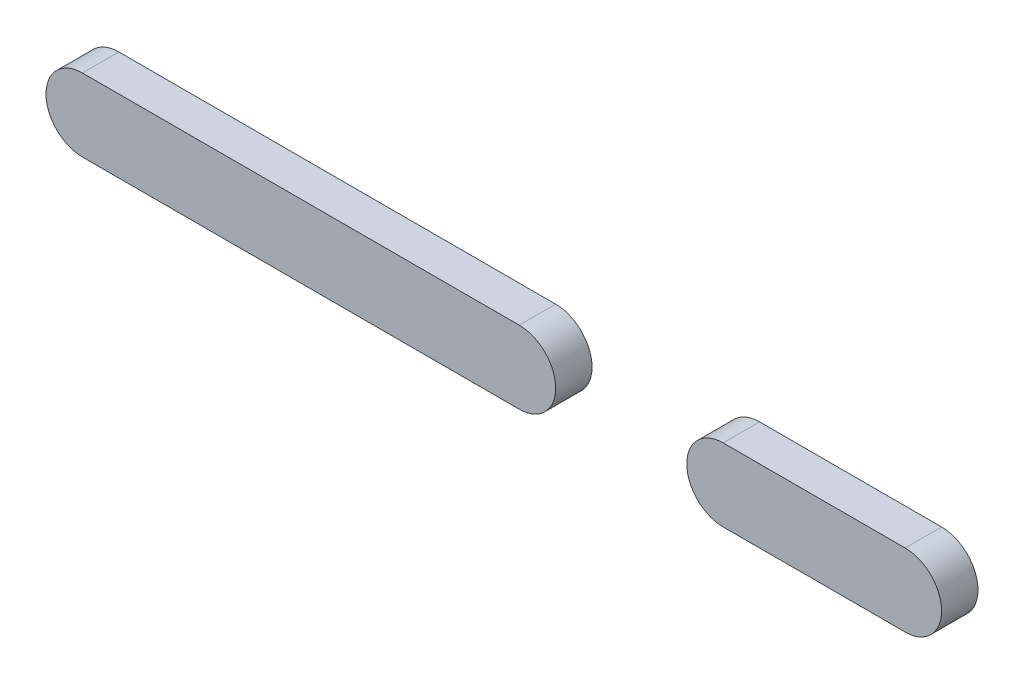
ISO-10303-21;
HEADER;
FILE_DESCRIPTION(('STEP AP214'),'2;1');
FILE_NAME('part.step','',(''),(''),'','','');
FILE_SCHEMA(('AUTOMOTIVE_DESIGN { 1 0 10303 214 1 1 1 1 }'));
ENDSEC;
DATA;
#1=APPLICATION_CONTEXT('core data for automotive mechanical design processes');
#2=APPLICATION_PROTOCOL_DEFINITION('international standard','automotive_design',2000,#1);
#3=PRODUCT_CONTEXT('',#1,'mechanical');
#4=PRODUCT('Part','Part','',(#3));
#5=PRODUCT_RELATED_PRODUCT_CATEGORY('part','',(#4));
#6=PRODUCT_DEFINITION_FORMATION('','',#4);
#7=PRODUCT_DEFINITION_CONTEXT('part definition',#1,'design');
#8=PRODUCT_DEFINITION('design','',#6,#7);
#9=PRODUCT_DEFINITION_SHAPE('','',#8);
#10=(LENGTH_UNIT() NAMED_UNIT(*) SI_UNIT(.MILLI.,.METRE.));
#11=(NAMED_UNIT(*) PLANE_ANGLE_UNIT() SI_UNIT($,.RADIAN.));
#12=(NAMED_UNIT(*) SI_UNIT($,.STERADIAN.) SOLID_ANGLE_UNIT());
#13=UNCERTAINTY_MEASURE_WITH_UNIT(LENGTH_MEASURE(1.E-05),#10,'distance_accuracy_value','');
#14=(GEOMETRIC_REPRESENTATION_CONTEXT(3) GLOBAL_UNCERTAINTY_ASSIGNED_CONTEXT((#13)) GLOBAL_UNIT_ASSIGNED_CONTEXT((#10,
#11,#12)) REPRESENTATION_CONTEXT('',''));
#15=CARTESIAN_POINT('',(0.,0.,0.));
#16=DIRECTION('',(0.,0.,1.));
#17=DIRECTION('',(1.,0.,0.));
#18=AXIS2_PLACEMENT_3D('',#15,#16,#17);
#19=CARTESIAN_POINT('',(1.03299492385786,-1.58676219316339,1.));
#20=DIRECTION('',(0.,0.,-1.));
#21=DIRECTION('',(-1.,0.,0.));
#22=AXIS2_PLACEMENT_3D('',#19,#20,#21);
#23=CYLINDRICAL_SURFACE('',#22,1.);
#24=CARTESIAN_POINT('',(1.03299492385786,-1.58676219316339,0.));
#25=DIRECTION('',(0.,0.,1.));
#26=DIRECTION('',(1.,0.,0.));
#27=AXIS2_PLACEMENT_3D('',#24,#25,#26);
#28=CIRCLE('',#27,1.);
#29=CARTESIAN_POINT('',(1.03299492385786,-0.586762193163393,0.));
#30=VERTEX_POINT('',#29);
#31=CARTESIAN_POINT('',(1.03299492385786,-2.58676219316339,0.));
#32=VERTEX_POINT('',#31);
#33=EDGE_CURVE('E12',#30,#32,#28,.T.);
#34=ORIENTED_EDGE('',*,*,#33,.T.);
#35=DIRECTION('',(0.,0.,-1.));
#36=VECTOR('',#35,1.);
#37=CARTESIAN_POINT('',(1.03299492385786,-2.58676219316339,1.));
#38=LINE('',#37,#36);
#39=CARTESIAN_POINT('',(1.03299492385786,-2.58676219316339,1.));
#40=VERTEX_POINT('',#39);
#41=EDGE_CURVE('E122',#40,#32,#38,.T.);
#42=ORIENTED_EDGE('',*,*,#41,.F.);
#43=CARTESIAN_POINT('',(1.03299492385786,-1.58676219316339,1.));
#44=DIRECTION('',(0.,0.,1.));
#45=DIRECTION('',(1.,0.,0.));
#46=AXIS2_PLACEMENT_3D('',#43,#44,#45);
#47=CIRCLE('',#46,1.);
#48=CARTESIAN_POINT('',(1.03299492385786,-0.586762193163393,1.));
#49=VERTEX_POINT('',#48);
#50=EDGE_CURVE('E55',#49,#40,#47,.T.);
#51=ORIENTED_EDGE('',*,*,#50,.F.);
#52=DIRECTION('',(0.,0.,-1.));
#53=VECTOR('',#52,1.);
#54=CARTESIAN_POINT('',(1.03299492385786,-0.586762193163393,1.));
#55=LINE('',#54,#53);
#56=EDGE_CURVE('E110',#49,#30,#55,.T.);
#57=ORIENTED_EDGE('',*,*,#56,.T.);
#58=EDGE_LOOP('',(#34,#42,#51,#57));
#59=FACE_BOUND('',#58,.T.);
#60=ADVANCED_FACE('F51',(#59),#23,.T.);
#61=CARTESIAN_POINT('',(1.03299492385786,-2.58676219316339,1.));
#62=DIRECTION('',(0.,1.,0.));
#63=DIRECTION('',(0.,0.,1.));
#64=AXIS2_PLACEMENT_3D('',#61,#62,#63);
#65=PLANE('',#64);
#66=DIRECTION('',(1.,0.,0.));
#67=VECTOR('',#66,1.);
#68=CARTESIAN_POINT('',(1.03299492385786,-2.58676219316339,0.));
#69=LINE('',#68,#67);
#70=CARTESIAN_POINT('',(6.03299492385786,-2.58676219316339,0.));
#71=VERTEX_POINT('',#70);
#72=EDGE_CURVE('E61',#32,#71,#69,.T.);
#73=ORIENTED_EDGE('',*,*,#72,.T.);
#74=DIRECTION('',(0.,0.,-1.));
#75=VECTOR('',#74,1.);
#76=CARTESIAN_POINT('',(6.03299492385786,-2.58676219316339,1.));
#77=LINE('',#76,#75);
#78=CARTESIAN_POINT('',(6.03299492385786,-2.58676219316339,1.));
#79=VERTEX_POINT('',#78);
#80=EDGE_CURVE('E106',#79,#71,#77,.T.);
#81=ORIENTED_EDGE('',*,*,#80,.F.);
#82=DIRECTION('',(1.,0.,0.));
#83=VECTOR('',#82,1.);
#84=CARTESIAN_POINT('',(1.03299492385786,-2.58676219316339,1.));
#85=LINE('',#84,#83);
#86=EDGE_CURVE('E85',#40,#79,#85,.T.);
#87=ORIENTED_EDGE('',*,*,#86,.F.);
#88=ORIENTED_EDGE('',*,*,#41,.T.);
#89=EDGE_LOOP('',(#73,#81,#87,#88));
#90=FACE_BOUND('',#89,.T.);
#91=ADVANCED_FACE('F125',(#90),#65,.F.);
#92=CARTESIAN_POINT('',(6.03299492385786,-1.58676219316339,1.));
#93=DIRECTION('',(0.,0.,-1.));
#94=DIRECTION('',(-1.,0.,0.));
#95=AXIS2_PLACEMENT_3D('',#92,#93,#94);
#96=CYLINDRICAL_SURFACE('',#95,1.);
#97=CARTESIAN_POINT('',(6.03299492385786,-1.58676219316339,0.));
#98=DIRECTION('',(0.,0.,1.));
#99=DIRECTION('',(1.,0.,0.));
#100=AXIS2_PLACEMENT_3D('',#97,#98,#99);
#101=CIRCLE('',#100,1.);
#102=CARTESIAN_POINT('',(6.03299492385786,-0.586762193163393,0.));
#103=VERTEX_POINT('',#102);
#104=EDGE_CURVE('E101',#71,#103,#101,.T.);
#105=ORIENTED_EDGE('',*,*,#104,.T.);
#106=DIRECTION('',(0.,0.,-1.));
#107=VECTOR('',#106,1.);
#108=CARTESIAN_POINT('',(6.03299492385786,-0.586762193163393,1.));
#109=LINE('',#108,#107);
#110=CARTESIAN_POINT('',(6.03299492385786,-0.586762193163393,1.));
#111=VERTEX_POINT('',#110);
#112=EDGE_CURVE('E104',#111,#103,#109,.T.);
#113=ORIENTED_EDGE('',*,*,#112,.F.);
#114=CARTESIAN_POINT('',(6.03299492385786,-1.58676219316339,1.));
#115=DIRECTION('',(0.,0.,1.));
#116=DIRECTION('',(1.,0.,0.));
#117=AXIS2_PLACEMENT_3D('',#114,#115,#116);
#118=CIRCLE('',#117,1.);
#119=EDGE_CURVE('E118',#79,#111,#118,.T.);
#120=ORIENTED_EDGE('',*,*,#119,.F.);
#121=ORIENTED_EDGE('',*,*,#80,.T.);
#122=EDGE_LOOP('',(#105,#113,#120,#121));
#123=FACE_BOUND('',#122,.T.);
#124=ADVANCED_FACE('F102',(#123),#96,.T.);
#125=CARTESIAN_POINT('',(1.03299492385786,-0.586762193163393,1.));
#126=DIRECTION('',(0.,-1.,0.));
#127=DIRECTION('',(0.,0.,-1.));
#128=AXIS2_PLACEMENT_3D('',#125,#126,#127);
#129=PLANE('',#128);
#130=DIRECTION('',(-1.,0.,0.));
#131=VECTOR('',#130,1.);
#132=CARTESIAN_POINT('',(1.03299492385786,-0.586762193163393,0.));
#133=LINE('',#132,#131);
#134=EDGE_CURVE('E95',#103,#30,#133,.T.);
#135=ORIENTED_EDGE('',*,*,#134,.T.);
#136=ORIENTED_EDGE('',*,*,#56,.F.);
#137=DIRECTION('',(-1.,0.,0.));
#138=VECTOR('',#137,1.);
#139=CARTESIAN_POINT('',(1.03299492385786,-0.586762193163393,1.));
#140=LINE('',#139,#138);
#141=EDGE_CURVE('E109',#111,#49,#140,.T.);
#142=ORIENTED_EDGE('',*,*,#141,.F.);
#143=ORIENTED_EDGE('',*,*,#112,.T.);
#144=EDGE_LOOP('',(#135,#136,#142,#143));
#145=FACE_BOUND('',#144,.T.);
#146=ADVANCED_FACE('F108',(#145),#129,.F.);
#147=CARTESIAN_POINT('',(1.03299492385786,-1.58676219316339,1.));
#148=DIRECTION('',(0.,0.,1.));
#149=DIRECTION('',(1.,0.,0.));
#150=AXIS2_PLACEMENT_3D('',#147,#148,#149);
#151=PLANE('',#150);
#152=ORIENTED_EDGE('',*,*,#50,.T.);
#153=ORIENTED_EDGE('',*,*,#86,.T.);
#154=ORIENTED_EDGE('',*,*,#119,.T.);
#155=ORIENTED_EDGE('',*,*,#141,.T.);
#156=EDGE_LOOP('',(#152,#153,#154,#155));
#157=FACE_BOUND('',#156,.T.);
#158=ADVANCED_FACE('F53',(#157),#151,.T.);
#159=CARTESIAN_POINT('',(1.03299492385786,-1.58676219316339,0.));
#160=DIRECTION('',(0.,0.,1.));
#161=DIRECTION('',(1.,0.,0.));
#162=AXIS2_PLACEMENT_3D('',#159,#160,#161);
#163=PLANE('',#162);
#164=ORIENTED_EDGE('',*,*,#33,.F.);
#165=ORIENTED_EDGE('',*,*,#134,.F.);
#166=ORIENTED_EDGE('',*,*,#104,.F.);
#167=ORIENTED_EDGE('',*,*,#72,.F.);
#168=EDGE_LOOP('',(#164,#165,#166,#167));
#169=FACE_BOUND('',#168,.T.);
#170=ADVANCED_FACE('F112',(#169),#163,.F.);
#171=CLOSED_SHELL('',(#60,#91,#124,#146,#158,#170));
#172=MANIFOLD_SOLID_BREP('B2',#171);
#173=CARTESIAN_POINT('',(-16.5685279187817,-1.58676219316339,1.));
#174=DIRECTION('',(0.,0.,-1.));
#175=DIRECTION('',(-1.,0.,0.));
#176=AXIS2_PLACEMENT_3D('',#173,#174,#175);
#177=CYLINDRICAL_SURFACE('',#176,1.);
#178=CARTESIAN_POINT('',(-16.5685279187817,-1.58676219316339,0.));
#179=DIRECTION('',(0.,0.,1.));
#180=DIRECTION('',(1.,0.,0.));
#181=AXIS2_PLACEMENT_3D('',#178,#179,#180);
#182=CIRCLE('',#181,1.);
#183=CARTESIAN_POINT('',(-16.5685279187817,-0.586762193163393,0.));
#184=VERTEX_POINT('',#183);
#185=CARTESIAN_POINT('',(-16.5685279187817,-2.58676219316339,0.));
#186=VERTEX_POINT('',#185);
#187=EDGE_CURVE('E250',#184,#186,#182,.T.);
#188=ORIENTED_EDGE('',*,*,#187,.T.);
#189=DIRECTION('',(0.,0.,-1.));
#190=VECTOR('',#189,1.);
#191=CARTESIAN_POINT('',(-16.5685279187817,-2.58676219316339,1.));
#192=LINE('',#191,#190);
#193=CARTESIAN_POINT('',(-16.5685279187817,-2.58676219316339,1.));
#194=VERTEX_POINT('',#193);
#195=EDGE_CURVE('E49',#194,#186,#192,.T.);
#196=ORIENTED_EDGE('',*,*,#195,.F.);
#197=CARTESIAN_POINT('',(-16.5685279187817,-1.58676219316339,1.));
#198=DIRECTION('',(0.,0.,1.));
#199=DIRECTION('',(1.,0.,0.));
#200=AXIS2_PLACEMENT_3D('',#197,#198,#199);
#201=CIRCLE('',#200,1.);
#202=CARTESIAN_POINT('',(-16.5685279187817,-0.586762193163393,1.));
#203=VERTEX_POINT('',#202);
#204=EDGE_CURVE('E238',#203,#194,#201,.T.);
#205=ORIENTED_EDGE('',*,*,#204,.F.);
#206=DIRECTION('',(0.,0.,-1.));
#207=VECTOR('',#206,1.);
#208=CARTESIAN_POINT('',(-16.5685279187817,-0.586762193163393,1.));
#209=LINE('',#208,#207);
#210=EDGE_CURVE('E246',#203,#184,#209,.T.);
#211=ORIENTED_EDGE('',*,*,#210,.T.);
#212=EDGE_LOOP('',(#188,#196,#205,#211));
#213=FACE_BOUND('',#212,.T.);
#214=ADVANCED_FACE('F187',(#213),#177,.T.);
#215=CARTESIAN_POINT('',(-16.5685279187817,-2.58676219316339,1.));
#216=DIRECTION('',(0.,1.,0.));
#217=DIRECTION('',(0.,0.,1.));
#218=AXIS2_PLACEMENT_3D('',#215,#216,#217);
#219=PLANE('',#218);
#220=DIRECTION('',(1.,0.,0.));
#221=VECTOR('',#220,1.);
#222=CARTESIAN_POINT('',(-16.5685279187817,-2.58676219316339,0.));
#223=LINE('',#222,#221);
#224=CARTESIAN_POINT('',(-4.56852791878173,-2.58676219316339,0.));
#225=VERTEX_POINT('',#224);
#226=EDGE_CURVE('E242',#186,#225,#223,.T.);
#227=ORIENTED_EDGE('',*,*,#226,.T.);
#228=DIRECTION('',(0.,0.,-1.));
#229=VECTOR('',#228,1.);
#230=CARTESIAN_POINT('',(-4.56852791878173,-2.58676219316339,1.));
#231=LINE('',#230,#229);
#232=CARTESIAN_POINT('',(-4.56852791878173,-2.58676219316339,1.));
#233=VERTEX_POINT('',#232);
#234=EDGE_CURVE('E195',#233,#225,#231,.T.);
#235=ORIENTED_EDGE('',*,*,#234,.F.);
#236=DIRECTION('',(1.,0.,0.));
#237=VECTOR('',#236,1.);
#238=CARTESIAN_POINT('',(-16.5685279187817,-2.58676219316339,1.));
#239=LINE('',#238,#237);
#240=EDGE_CURVE('E233',#194,#233,#239,.T.);
#241=ORIENTED_EDGE('',*,*,#240,.F.);
#242=ORIENTED_EDGE('',*,*,#195,.T.);
#243=EDGE_LOOP('',(#227,#235,#241,#242));
#244=FACE_BOUND('',#243,.T.);
#245=ADVANCED_FACE('F241',(#244),#219,.F.);
#246=CARTESIAN_POINT('',(-4.56852791878172,-1.58676219316339,1.));
#247=DIRECTION('',(0.,0.,-1.));
#248=DIRECTION('',(-1.,0.,0.));
#249=AXIS2_PLACEMENT_3D('',#246,#247,#248);
#250=CYLINDRICAL_SURFACE('',#249,1.);
#251=CARTESIAN_POINT('',(-4.56852791878172,-1.58676219316339,0.));
#252=DIRECTION('',(0.,0.,1.));
#253=DIRECTION('',(1.,0.,0.));
#254=AXIS2_PLACEMENT_3D('',#251,#252,#253);
#255=CIRCLE('',#254,1.);
#256=CARTESIAN_POINT('',(-4.56852791878172,-0.586762193163393,0.));
#257=VERTEX_POINT('',#256);
#258=EDGE_CURVE('E220',#225,#257,#255,.T.);
#259=ORIENTED_EDGE('',*,*,#258,.T.);
#260=DIRECTION('',(0.,0.,-1.));
#261=VECTOR('',#260,1.);
#262=CARTESIAN_POINT('',(-4.56852791878172,-0.586762193163393,1.));
#263=LINE('',#262,#261);
#264=CARTESIAN_POINT('',(-4.56852791878172,-0.586762193163393,1.));
#265=VERTEX_POINT('',#264);
#266=EDGE_CURVE('E243',#265,#257,#263,.T.);
#267=ORIENTED_EDGE('',*,*,#266,.F.);
#268=CARTESIAN_POINT('',(-4.56852791878172,-1.58676219316339,1.));
#269=DIRECTION('',(0.,0.,1.));
#270=DIRECTION('',(1.,0.,0.));
#271=AXIS2_PLACEMENT_3D('',#268,#269,#270);
#272=CIRCLE('',#271,1.);
#273=EDGE_CURVE('E236',#233,#265,#272,.T.);
#274=ORIENTED_EDGE('',*,*,#273,.F.);
#275=ORIENTED_EDGE('',*,*,#234,.T.);
#276=EDGE_LOOP('',(#259,#267,#274,#275));
#277=FACE_BOUND('',#276,.T.);
#278=ADVANCED_FACE('F244',(#277),#250,.T.);
#279=CARTESIAN_POINT('',(-16.5685279187817,-0.586762193163393,1.));
#280=DIRECTION('',(0.,-1.,0.));
#281=DIRECTION('',(0.,0.,-1.));
#282=AXIS2_PLACEMENT_3D('',#279,#280,#281);
#283=PLANE('',#282);
#284=DIRECTION('',(-1.,0.,0.));
#285=VECTOR('',#284,1.);
#286=CARTESIAN_POINT('',(-16.5685279187817,-0.586762193163393,0.));
#287=LINE('',#286,#285);
#288=EDGE_CURVE('E226',#257,#184,#287,.T.);
#289=ORIENTED_EDGE('',*,*,#288,.T.);
#290=ORIENTED_EDGE('',*,*,#210,.F.);
#291=DIRECTION('',(-1.,0.,0.));
#292=VECTOR('',#291,1.);
#293=CARTESIAN_POINT('',(-16.5685279187817,-0.586762193163393,1.));
#294=LINE('',#293,#292);
#295=EDGE_CURVE('E203',#265,#203,#294,.T.);
#296=ORIENTED_EDGE('',*,*,#295,.F.);
#297=ORIENTED_EDGE('',*,*,#266,.T.);
#298=EDGE_LOOP('',(#289,#290,#296,#297));
#299=FACE_BOUND('',#298,.T.);
#300=ADVANCED_FACE('F257',(#299),#283,.F.);
#301=CARTESIAN_POINT('',(-16.5685279187817,-1.58676219316339,1.));
#302=DIRECTION('',(0.,0.,1.));
#303=DIRECTION('',(1.,0.,0.));
#304=AXIS2_PLACEMENT_3D('',#301,#302,#303);
#305=PLANE('',#304);
#306=ORIENTED_EDGE('',*,*,#204,.T.);
#307=ORIENTED_EDGE('',*,*,#240,.T.);
#308=ORIENTED_EDGE('',*,*,#273,.T.);
#309=ORIENTED_EDGE('',*,*,#295,.T.);
#310=EDGE_LOOP('',(#306,#307,#308,#309));
#311=FACE_BOUND('',#310,.T.);
#312=ADVANCED_FACE('F234',(#311),#305,.T.);
#313=CARTESIAN_POINT('',(-16.5685279187817,-1.58676219316339,0.));
#314=DIRECTION('',(0.,0.,1.));
#315=DIRECTION('',(1.,0.,0.));
#316=AXIS2_PLACEMENT_3D('',#313,#314,#315);
#317=PLANE('',#316);
#318=ORIENTED_EDGE('',*,*,#187,.F.);
#319=ORIENTED_EDGE('',*,*,#288,.F.);
#320=ORIENTED_EDGE('',*,*,#258,.F.);
#321=ORIENTED_EDGE('',*,*,#226,.F.);
#322=EDGE_LOOP('',(#318,#319,#320,#321));
#323=FACE_BOUND('',#322,.T.);
#324=ADVANCED_FACE('F260',(#323),#317,.F.);
#325=CLOSED_SHELL('',(#214,#245,#278,#300,#312,#324));
#326=MANIFOLD_SOLID_BREP('B6',#325);
#327=ADVANCED_BREP_SHAPE_REPRESENTATION('',(#18,#172,#326),#14);
#328=SHAPE_DEFINITION_REPRESENTATION(#9,#327);
ENDSEC;
END-ISO-10303-21;
